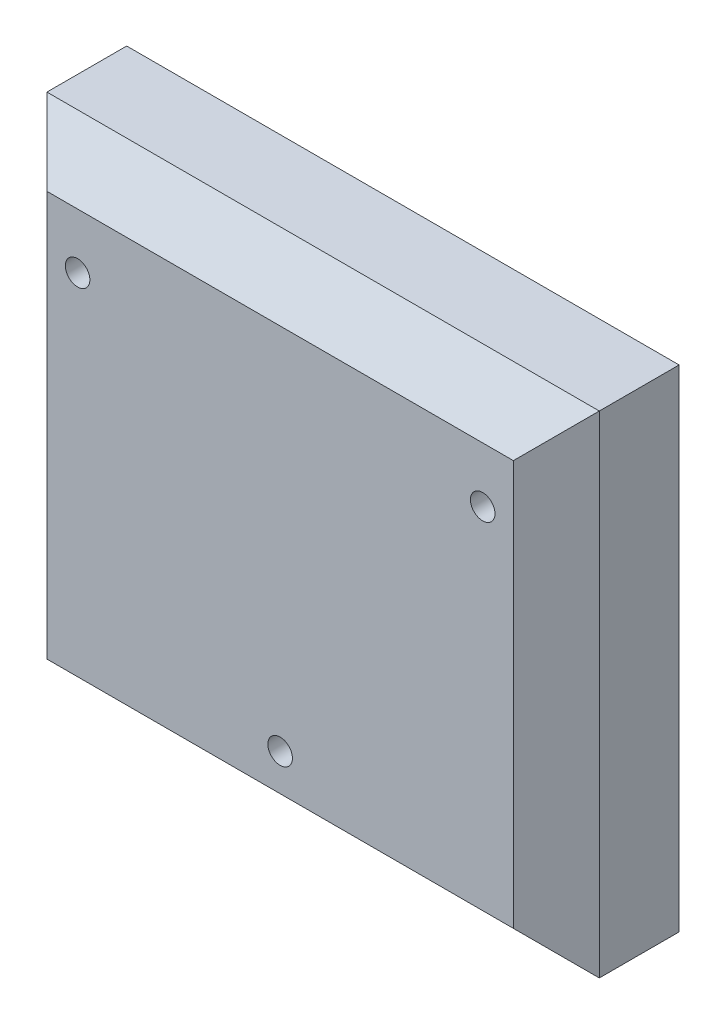
ISO-10303-21;
HEADER;
FILE_DESCRIPTION(('STEP AP214'),'2;1');
FILE_NAME('part.step','',(''),(''),'','','');
FILE_SCHEMA(('AUTOMOTIVE_DESIGN { 1 0 10303 214 1 1 1 1 }'));
ENDSEC;
DATA;
#1=APPLICATION_CONTEXT('core data for automotive mechanical design processes');
#2=APPLICATION_PROTOCOL_DEFINITION('international standard','automotive_design',2000,#1);
#3=PRODUCT_CONTEXT('',#1,'mechanical');
#4=PRODUCT('Part','Part','',(#3));
#5=PRODUCT_RELATED_PRODUCT_CATEGORY('part','',(#4));
#6=PRODUCT_DEFINITION_FORMATION('','',#4);
#7=PRODUCT_DEFINITION_CONTEXT('part definition',#1,'design');
#8=PRODUCT_DEFINITION('design','',#6,#7);
#9=PRODUCT_DEFINITION_SHAPE('','',#8);
#10=(LENGTH_UNIT() NAMED_UNIT(*) SI_UNIT(.MILLI.,.METRE.));
#11=(NAMED_UNIT(*) PLANE_ANGLE_UNIT() SI_UNIT($,.RADIAN.));
#12=(NAMED_UNIT(*) SI_UNIT($,.STERADIAN.) SOLID_ANGLE_UNIT());
#13=UNCERTAINTY_MEASURE_WITH_UNIT(LENGTH_MEASURE(1.E-05),#10,'distance_accuracy_value','');
#14=(GEOMETRIC_REPRESENTATION_CONTEXT(3) GLOBAL_UNCERTAINTY_ASSIGNED_CONTEXT((#13)) GLOBAL_UNIT_ASSIGNED_CONTEXT((#10,
#11,#12)) REPRESENTATION_CONTEXT('',''));
#15=CARTESIAN_POINT('',(0.,0.,0.));
#16=DIRECTION('',(0.,0.,1.));
#17=DIRECTION('',(1.,0.,0.));
#18=AXIS2_PLACEMENT_3D('',#15,#16,#17);
#19=CARTESIAN_POINT('',(45.,34.2575501706836,13.));
#20=DIRECTION('',(-1.,0.,0.));
#21=DIRECTION('',(0.,-1.,0.));
#22=AXIS2_PLACEMENT_3D('',#19,#20,#21);
#23=PLANE('',#22);
#24=DIRECTION('',(0.,1.,0.));
#25=VECTOR('',#24,1.);
#26=CARTESIAN_POINT('',(45.,34.2575501706836,0.));
#27=LINE('',#26,#25);
#28=CARTESIAN_POINT('',(45.,-45.7424498293164,0.));
#29=VERTEX_POINT('',#28);
#30=CARTESIAN_POINT('',(45.,34.2575501706836,0.));
#31=VERTEX_POINT('',#30);
#32=EDGE_CURVE('E136',#29,#31,#27,.T.);
#33=ORIENTED_EDGE('',*,*,#32,.T.);
#34=DIRECTION('',(0.,0.,-1.));
#35=VECTOR('',#34,1.);
#36=CARTESIAN_POINT('',(45.,34.2575501706836,13.));
#37=LINE('',#36,#35);
#38=CARTESIAN_POINT('',(45.,34.2575501706836,13.));
#39=VERTEX_POINT('',#38);
#40=EDGE_CURVE('E106',#39,#31,#37,.T.);
#41=ORIENTED_EDGE('',*,*,#40,.F.);
#42=DIRECTION('',(0.,1.,0.));
#43=VECTOR('',#42,1.);
#44=CARTESIAN_POINT('',(45.,34.2575501706836,13.));
#45=LINE('',#44,#43);
#46=CARTESIAN_POINT('',(45.,-45.7424498293164,13.));
#47=VERTEX_POINT('',#46);
#48=EDGE_CURVE('E89',#47,#39,#45,.T.);
#49=ORIENTED_EDGE('',*,*,#48,.F.);
#50=DIRECTION('',(0.,0.,-1.));
#51=VECTOR('',#50,1.);
#52=CARTESIAN_POINT('',(45.,-45.7424498293164,13.));
#53=LINE('',#52,#51);
#54=EDGE_CURVE('E103',#47,#29,#53,.T.);
#55=ORIENTED_EDGE('',*,*,#54,.T.);
#56=EDGE_LOOP('',(#33,#41,#49,#55));
#57=FACE_BOUND('',#56,.T.);
#58=ADVANCED_FACE('F32',(#57),#23,.F.);
#59=CARTESIAN_POINT('',(-45.,34.2575501706836,13.));
#60=DIRECTION('',(0.,-1.,0.));
#61=DIRECTION('',(0.,0.,-1.));
#62=AXIS2_PLACEMENT_3D('',#59,#60,#61);
#63=PLANE('',#62);
#64=DIRECTION('',(0.,0.,-1.));
#65=VECTOR('',#64,1.);
#66=CARTESIAN_POINT('',(-45.,34.2575501706836,13.));
#67=LINE('',#66,#65);
#68=CARTESIAN_POINT('',(-45.,34.2575501706836,13.));
#69=VERTEX_POINT('',#68);
#70=CARTESIAN_POINT('',(-45.,34.2575501706836,0.));
#71=VERTEX_POINT('',#70);
#72=EDGE_CURVE('E127',#69,#71,#67,.T.);
#73=ORIENTED_EDGE('',*,*,#72,.F.);
#74=DIRECTION('',(1.,0.,0.));
#75=VECTOR('',#74,1.);
#76=CARTESIAN_POINT('',(-45.,34.2575501706836,13.));
#77=LINE('',#76,#75);
#78=EDGE_CURVE('E11',#69,#39,#77,.T.);
#79=ORIENTED_EDGE('',*,*,#78,.T.);
#80=ORIENTED_EDGE('',*,*,#40,.T.);
#81=DIRECTION('',(-1.,0.,0.));
#82=VECTOR('',#81,1.);
#83=CARTESIAN_POINT('',(-45.,34.2575501706836,0.));
#84=LINE('',#83,#82);
#85=EDGE_CURVE('E134',#31,#71,#84,.T.);
#86=ORIENTED_EDGE('',*,*,#85,.T.);
#87=EDGE_LOOP('',(#73,#79,#80,#86));
#88=FACE_BOUND('',#87,.T.);
#89=ADVANCED_FACE('F183',(#88),#63,.F.);
#90=CARTESIAN_POINT('',(-45.,-45.7424498293164,13.));
#91=DIRECTION('',(1.,0.,0.));
#92=DIRECTION('',(0.,0.,-1.));
#93=AXIS2_PLACEMENT_3D('',#90,#91,#92);
#94=PLANE('',#93);
#95=DIRECTION('',(0.,-1.,0.));
#96=VECTOR('',#95,1.);
#97=CARTESIAN_POINT('',(-45.,-45.7424498293164,0.));
#98=LINE('',#97,#96);
#99=CARTESIAN_POINT('',(-45.,-45.7424498293164,0.));
#100=VERTEX_POINT('',#99);
#101=EDGE_CURVE('E132',#71,#100,#98,.T.);
#102=ORIENTED_EDGE('',*,*,#101,.T.);
#103=DIRECTION('',(0.,0.,-1.));
#104=VECTOR('',#103,1.);
#105=CARTESIAN_POINT('',(-45.,-45.7424498293164,13.));
#106=LINE('',#105,#104);
#107=CARTESIAN_POINT('',(-45.,-45.7424498293164,13.));
#108=VERTEX_POINT('',#107);
#109=EDGE_CURVE('E115',#108,#100,#106,.T.);
#110=ORIENTED_EDGE('',*,*,#109,.F.);
#111=DIRECTION('',(0.,-1.,0.));
#112=VECTOR('',#111,1.);
#113=CARTESIAN_POINT('',(-45.,-45.7424498293164,13.));
#114=LINE('',#113,#112);
#115=EDGE_CURVE('E107',#69,#108,#114,.T.);
#116=ORIENTED_EDGE('',*,*,#115,.F.);
#117=ORIENTED_EDGE('',*,*,#72,.T.);
#118=EDGE_LOOP('',(#102,#110,#116,#117));
#119=FACE_BOUND('',#118,.T.);
#120=ADVANCED_FACE('F189',(#119),#94,.F.);
#121=CARTESIAN_POINT('',(45.,-45.7424498293164,13.));
#122=DIRECTION('',(0.,1.,0.));
#123=DIRECTION('',(-1.,0.,0.));
#124=AXIS2_PLACEMENT_3D('',#121,#122,#123);
#125=PLANE('',#124);
#126=ORIENTED_EDGE('',*,*,#54,.F.);
#127=DIRECTION('',(-1.,0.,0.));
#128=VECTOR('',#127,1.);
#129=CARTESIAN_POINT('',(45.,-45.7424498293164,13.));
#130=LINE('',#129,#128);
#131=EDGE_CURVE('E95',#47,#108,#130,.T.);
#132=ORIENTED_EDGE('',*,*,#131,.T.);
#133=ORIENTED_EDGE('',*,*,#109,.T.);
#134=DIRECTION('',(1.,0.,0.));
#135=VECTOR('',#134,1.);
#136=CARTESIAN_POINT('',(45.,-45.7424498293164,0.));
#137=LINE('',#136,#135);
#138=EDGE_CURVE('E108',#100,#29,#137,.T.);
#139=ORIENTED_EDGE('',*,*,#138,.T.);
#140=EDGE_LOOP('',(#126,#132,#133,#139));
#141=FACE_BOUND('',#140,.T.);
#142=ADVANCED_FACE('F111',(#141),#125,.F.);
#143=CARTESIAN_POINT('',(0.,0.,0.));
#144=DIRECTION('',(0.,0.,-1.));
#145=DIRECTION('',(-1.,0.,0.));
#146=AXIS2_PLACEMENT_3D('',#143,#144,#145);
#147=PLANE('',#146);
#148=CARTESIAN_POINT('',(33.,18.2575501706836,0.));
#149=DIRECTION('',(0.,0.,-1.));
#150=DIRECTION('',(-1.,0.,0.));
#151=AXIS2_PLACEMENT_3D('',#148,#149,#150);
#152=CIRCLE('',#151,2.);
#153=CARTESIAN_POINT('',(31.,18.2575501706836,0.));
#154=VERTEX_POINT('',#153);
#155=EDGE_CURVE('E155',#154,#154,#152,.T.);
#156=ORIENTED_EDGE('',*,*,#155,.F.);
#157=EDGE_LOOP('',(#156));
#158=FACE_BOUND('',#157,.T.);
#159=CARTESIAN_POINT('',(-33.,18.2575501706836,0.));
#160=DIRECTION('',(0.,0.,-1.));
#161=DIRECTION('',(-1.,0.,0.));
#162=AXIS2_PLACEMENT_3D('',#159,#160,#161);
#163=CIRCLE('',#162,2.);
#164=CARTESIAN_POINT('',(-35.,18.2575501706836,0.));
#165=VERTEX_POINT('',#164);
#166=EDGE_CURVE('E152',#165,#165,#163,.T.);
#167=ORIENTED_EDGE('',*,*,#166,.F.);
#168=EDGE_LOOP('',(#167));
#169=FACE_BOUND('',#168,.T.);
#170=CARTESIAN_POINT('',(0.,-32.7424498293164,0.));
#171=DIRECTION('',(0.,0.,-1.));
#172=DIRECTION('',(-1.,0.,0.));
#173=AXIS2_PLACEMENT_3D('',#170,#171,#172);
#174=CIRCLE('',#173,2.);
#175=CARTESIAN_POINT('',(-2.,-32.7424498293164,0.));
#176=VERTEX_POINT('',#175);
#177=EDGE_CURVE('E143',#176,#176,#174,.T.);
#178=ORIENTED_EDGE('',*,*,#177,.F.);
#179=EDGE_LOOP('',(#178));
#180=FACE_BOUND('',#179,.T.);
#181=ORIENTED_EDGE('',*,*,#32,.F.);
#182=ORIENTED_EDGE('',*,*,#138,.F.);
#183=ORIENTED_EDGE('',*,*,#101,.F.);
#184=ORIENTED_EDGE('',*,*,#85,.F.);
#185=EDGE_LOOP('',(#181,#182,#183,#184));
#186=FACE_BOUND('',#185,.T.);
#187=ADVANCED_FACE('F171',(#158,#169,#180,#186),#147,.T.);
#188=CARTESIAN_POINT('',(-45.,34.2575501706836,13.));
#189=DIRECTION('',(0.707106781186549,0.,-0.707106781186546));
#190=DIRECTION('',(-0.707106781186546,0.,-0.707106781186549));
#191=AXIS2_PLACEMENT_3D('',#188,#189,#190);
#192=PLANE('',#191);
#193=ORIENTED_EDGE('',*,*,#115,.T.);
#194=DIRECTION('',(-0.577350269189625,-0.577350269189625,-0.577350269189627));
#195=VECTOR('',#194,1.);
#196=CARTESIAN_POINT('',(-38.,-38.7424498293164,20.));
#197=LINE('',#196,#195);
#198=CARTESIAN_POINT('',(-38.,-38.7424498293164,20.));
#199=VERTEX_POINT('',#198);
#200=EDGE_CURVE('E40',#108,#199,#197,.F.);
#201=ORIENTED_EDGE('',*,*,#200,.T.);
#202=DIRECTION('',(0.,-1.,0.));
#203=VECTOR('',#202,1.);
#204=CARTESIAN_POINT('',(-38.,34.2575501706836,20.));
#205=LINE('',#204,#203);
#206=CARTESIAN_POINT('',(-38.,27.2575501706836,20.));
#207=VERTEX_POINT('',#206);
#208=EDGE_CURVE('E138',#207,#199,#205,.T.);
#209=ORIENTED_EDGE('',*,*,#208,.F.);
#210=DIRECTION('',(0.577350269189624,-0.577350269189627,0.577350269189626));
#211=VECTOR('',#210,1.);
#212=CARTESIAN_POINT('',(-45.,34.2575501706836,13.));
#213=LINE('',#212,#211);
#214=EDGE_CURVE('E118',#207,#69,#213,.F.);
#215=ORIENTED_EDGE('',*,*,#214,.T.);
#216=EDGE_LOOP('',(#193,#201,#209,#215));
#217=FACE_BOUND('',#216,.T.);
#218=ADVANCED_FACE('F174',(#217),#192,.F.);
#219=CARTESIAN_POINT('',(-38.,34.2575501706836,20.));
#220=DIRECTION('',(0.,0.,-1.));
#221=DIRECTION('',(-1.,0.,0.));
#222=AXIS2_PLACEMENT_3D('',#219,#220,#221);
#223=PLANE('',#222);
#224=CARTESIAN_POINT('',(33.,18.2575501706836,20.));
#225=DIRECTION('',(0.,0.,-1.));
#226=DIRECTION('',(-1.,0.,0.));
#227=AXIS2_PLACEMENT_3D('',#224,#225,#226);
#228=CIRCLE('',#227,2.);
#229=CARTESIAN_POINT('',(31.,18.2575501706836,20.));
#230=VERTEX_POINT('',#229);
#231=EDGE_CURVE('E146',#230,#230,#228,.T.);
#232=ORIENTED_EDGE('',*,*,#231,.T.);
#233=EDGE_LOOP('',(#232));
#234=FACE_BOUND('',#233,.T.);
#235=CARTESIAN_POINT('',(-33.,18.2575501706836,20.));
#236=DIRECTION('',(0.,0.,-1.));
#237=DIRECTION('',(-1.,0.,0.));
#238=AXIS2_PLACEMENT_3D('',#235,#236,#237);
#239=CIRCLE('',#238,2.);
#240=CARTESIAN_POINT('',(-35.,18.2575501706836,20.));
#241=VERTEX_POINT('',#240);
#242=EDGE_CURVE('E149',#241,#241,#239,.T.);
#243=ORIENTED_EDGE('',*,*,#242,.T.);
#244=EDGE_LOOP('',(#243));
#245=FACE_BOUND('',#244,.T.);
#246=CARTESIAN_POINT('',(0.,-32.7424498293164,20.));
#247=DIRECTION('',(0.,0.,-1.));
#248=DIRECTION('',(-1.,0.,0.));
#249=AXIS2_PLACEMENT_3D('',#246,#247,#248);
#250=CIRCLE('',#249,2.);
#251=CARTESIAN_POINT('',(-2.,-32.7424498293164,20.));
#252=VERTEX_POINT('',#251);
#253=EDGE_CURVE('E141',#252,#252,#250,.T.);
#254=ORIENTED_EDGE('',*,*,#253,.T.);
#255=EDGE_LOOP('',(#254));
#256=FACE_BOUND('',#255,.T.);
#257=ORIENTED_EDGE('',*,*,#208,.T.);
#258=DIRECTION('',(1.,0.,0.));
#259=VECTOR('',#258,1.);
#260=CARTESIAN_POINT('',(-38.,-38.7424498293164,20.));
#261=LINE('',#260,#259);
#262=CARTESIAN_POINT('',(37.9999999999999,-38.7424498293163,20.));
#263=VERTEX_POINT('',#262);
#264=EDGE_CURVE('E123',#199,#263,#261,.T.);
#265=ORIENTED_EDGE('',*,*,#264,.T.);
#266=DIRECTION('',(0.,-1.,0.));
#267=VECTOR('',#266,1.);
#268=CARTESIAN_POINT('',(37.9999999999999,34.2575501706836,20.));
#269=LINE('',#268,#267);
#270=CARTESIAN_POINT('',(37.9999999999999,27.2575501706836,20.));
#271=VERTEX_POINT('',#270);
#272=EDGE_CURVE('E90',#271,#263,#269,.T.);
#273=ORIENTED_EDGE('',*,*,#272,.F.);
#274=DIRECTION('',(-1.,0.,0.));
#275=VECTOR('',#274,1.);
#276=CARTESIAN_POINT('',(-38.,27.2575501706836,20.));
#277=LINE('',#276,#275);
#278=EDGE_CURVE('E53',#271,#207,#277,.T.);
#279=ORIENTED_EDGE('',*,*,#278,.T.);
#280=EDGE_LOOP('',(#257,#265,#273,#279));
#281=FACE_BOUND('',#280,.T.);
#282=ADVANCED_FACE('F161',(#234,#245,#256,#281),#223,.F.);
#283=CARTESIAN_POINT('',(45.,34.2575501706836,13.));
#284=DIRECTION('',(0.707106781186544,0.,0.707106781186551));
#285=DIRECTION('',(0.707106781186551,0.,-0.707106781186544));
#286=AXIS2_PLACEMENT_3D('',#283,#284,#285);
#287=PLANE('',#286);
#288=ORIENTED_EDGE('',*,*,#272,.T.);
#289=DIRECTION('',(-0.577350269189631,0.577350269189622,0.577350269189625));
#290=VECTOR('',#289,1.);
#291=CARTESIAN_POINT('',(18.3333333333333,-19.07578316265,39.6666666666664));
#292=LINE('',#291,#290);
#293=EDGE_CURVE('E86',#263,#47,#292,.F.);
#294=ORIENTED_EDGE('',*,*,#293,.T.);
#295=ORIENTED_EDGE('',*,*,#48,.T.);
#296=DIRECTION('',(0.577350269189629,0.577350269189625,-0.577350269189623));
#297=VECTOR('',#296,1.);
#298=CARTESIAN_POINT('',(45.,34.2575501706836,13.));
#299=LINE('',#298,#297);
#300=EDGE_CURVE('E96',#39,#271,#299,.F.);
#301=ORIENTED_EDGE('',*,*,#300,.T.);
#302=EDGE_LOOP('',(#288,#294,#295,#301));
#303=FACE_BOUND('',#302,.T.);
#304=ADVANCED_FACE('F88',(#303),#287,.T.);
#305=CARTESIAN_POINT('',(-38.,-38.7424498293164,20.));
#306=DIRECTION('',(0.,0.707106781186549,-0.707106781186546));
#307=DIRECTION('',(1.,0.,0.));
#308=AXIS2_PLACEMENT_3D('',#305,#306,#307);
#309=PLANE('',#308);
#310=ORIENTED_EDGE('',*,*,#200,.F.);
#311=ORIENTED_EDGE('',*,*,#131,.F.);
#312=ORIENTED_EDGE('',*,*,#293,.F.);
#313=ORIENTED_EDGE('',*,*,#264,.F.);
#314=EDGE_LOOP('',(#310,#311,#312,#313));
#315=FACE_BOUND('',#314,.T.);
#316=ADVANCED_FACE('F117',(#315),#309,.F.);
#317=CARTESIAN_POINT('',(-45.,34.2575501706836,13.));
#318=DIRECTION('',(0.,-0.707106781186547,-0.707106781186548));
#319=DIRECTION('',(1.,0.,0.));
#320=AXIS2_PLACEMENT_3D('',#317,#318,#319);
#321=PLANE('',#320);
#322=ORIENTED_EDGE('',*,*,#214,.F.);
#323=ORIENTED_EDGE('',*,*,#278,.F.);
#324=ORIENTED_EDGE('',*,*,#300,.F.);
#325=ORIENTED_EDGE('',*,*,#78,.F.);
#326=EDGE_LOOP('',(#322,#323,#324,#325));
#327=FACE_BOUND('',#326,.T.);
#328=ADVANCED_FACE('F34',(#327),#321,.F.);
#329=CARTESIAN_POINT('',(0.,-32.7424498293164,20.));
#330=DIRECTION('',(0.,0.,-1.));
#331=DIRECTION('',(-1.,0.,0.));
#332=AXIS2_PLACEMENT_3D('',#329,#330,#331);
#333=CYLINDRICAL_SURFACE('',#332,2.);
#334=ORIENTED_EDGE('',*,*,#253,.F.);
#335=EDGE_LOOP('',(#334));
#336=FACE_BOUND('',#335,.T.);
#337=ORIENTED_EDGE('',*,*,#177,.T.);
#338=EDGE_LOOP('',(#337));
#339=FACE_BOUND('',#338,.T.);
#340=ADVANCED_FACE('F207',(#336,#339),#333,.F.);
#341=CARTESIAN_POINT('',(-33.,18.2575501706836,20.));
#342=DIRECTION('',(0.,0.,-1.));
#343=DIRECTION('',(-1.,0.,0.));
#344=AXIS2_PLACEMENT_3D('',#341,#342,#343);
#345=CYLINDRICAL_SURFACE('',#344,2.);
#346=ORIENTED_EDGE('',*,*,#242,.F.);
#347=EDGE_LOOP('',(#346));
#348=FACE_BOUND('',#347,.T.);
#349=ORIENTED_EDGE('',*,*,#166,.T.);
#350=EDGE_LOOP('',(#349));
#351=FACE_BOUND('',#350,.T.);
#352=ADVANCED_FACE('F167',(#348,#351),#345,.F.);
#353=CARTESIAN_POINT('',(33.,18.2575501706836,20.));
#354=DIRECTION('',(0.,0.,-1.));
#355=DIRECTION('',(-1.,0.,0.));
#356=AXIS2_PLACEMENT_3D('',#353,#354,#355);
#357=CYLINDRICAL_SURFACE('',#356,2.);
#358=ORIENTED_EDGE('',*,*,#231,.F.);
#359=EDGE_LOOP('',(#358));
#360=FACE_BOUND('',#359,.T.);
#361=ORIENTED_EDGE('',*,*,#155,.T.);
#362=EDGE_LOOP('',(#361));
#363=FACE_BOUND('',#362,.T.);
#364=ADVANCED_FACE('F164',(#360,#363),#357,.F.);
#365=CLOSED_SHELL('',(#58,#89,#120,#142,#187,#218,#282,#304,#316,#328,#340,#352,#364));
#366=MANIFOLD_SOLID_BREP('B2',#365);
#367=ADVANCED_BREP_SHAPE_REPRESENTATION('',(#18,#366),#14);
#368=SHAPE_DEFINITION_REPRESENTATION(#9,#367);
ENDSEC;
END-ISO-10303-21;
